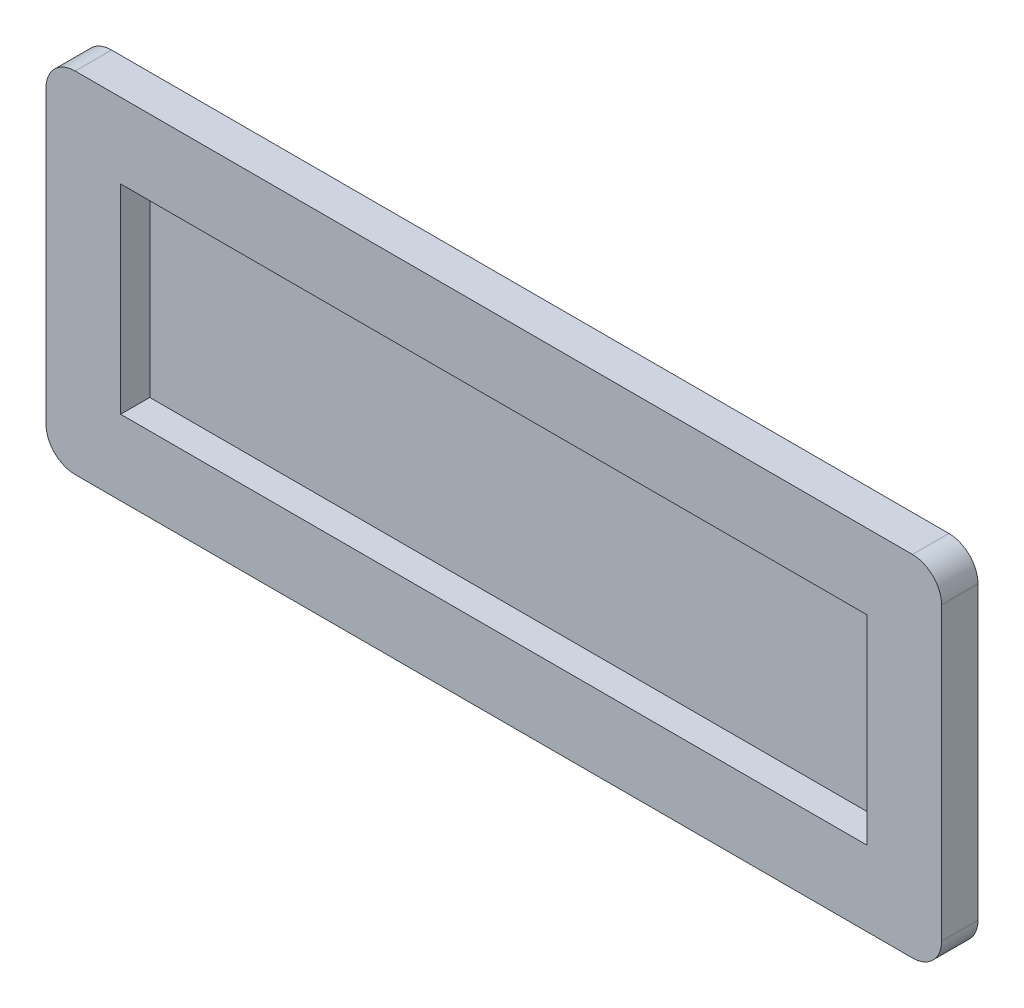
ISO-10303-21;
HEADER;
FILE_DESCRIPTION(('STEP AP214'),'2;1');
FILE_NAME('part.step','',(''),(''),'','','');
FILE_SCHEMA(('AUTOMOTIVE_DESIGN { 1 0 10303 214 1 1 1 1 }'));
ENDSEC;
DATA;
#1=APPLICATION_CONTEXT('core data for automotive mechanical design processes');
#2=APPLICATION_PROTOCOL_DEFINITION('international standard','automotive_design',2000,#1);
#3=PRODUCT_CONTEXT('',#1,'mechanical');
#4=PRODUCT('Part','Part','',(#3));
#5=PRODUCT_RELATED_PRODUCT_CATEGORY('part','',(#4));
#6=PRODUCT_DEFINITION_FORMATION('','',#4);
#7=PRODUCT_DEFINITION_CONTEXT('part definition',#1,'design');
#8=PRODUCT_DEFINITION('design','',#6,#7);
#9=PRODUCT_DEFINITION_SHAPE('','',#8);
#10=(LENGTH_UNIT() NAMED_UNIT(*) SI_UNIT(.MILLI.,.METRE.));
#11=(NAMED_UNIT(*) PLANE_ANGLE_UNIT() SI_UNIT($,.RADIAN.));
#12=(NAMED_UNIT(*) SI_UNIT($,.STERADIAN.) SOLID_ANGLE_UNIT());
#13=UNCERTAINTY_MEASURE_WITH_UNIT(LENGTH_MEASURE(1.E-05),#10,'distance_accuracy_value','');
#14=(GEOMETRIC_REPRESENTATION_CONTEXT(3) GLOBAL_UNCERTAINTY_ASSIGNED_CONTEXT((#13)) GLOBAL_UNIT_ASSIGNED_CONTEXT((#10,
#11,#12)) REPRESENTATION_CONTEXT('',''));
#15=CARTESIAN_POINT('',(0.,0.,0.));
#16=DIRECTION('',(0.,0.,1.));
#17=DIRECTION('',(1.,0.,0.));
#18=AXIS2_PLACEMENT_3D('',#15,#16,#17);
#19=CARTESIAN_POINT('',(20.5,75.4,10.));
#20=DIRECTION('',(1.,0.,0.));
#21=DIRECTION('',(0.,1.,0.));
#22=AXIS2_PLACEMENT_3D('',#19,#20,#21);
#23=PLANE('',#22);
#24=DIRECTION('',(0.,0.,-1.));
#25=VECTOR('',#24,1.);
#26=CARTESIAN_POINT('',(20.5,20.6,10.));
#27=LINE('',#26,#25);
#28=CARTESIAN_POINT('',(20.5,20.6,10.));
#29=VERTEX_POINT('',#28);
#30=CARTESIAN_POINT('',(20.5,20.6,2.));
#31=VERTEX_POINT('',#30);
#32=EDGE_CURVE('E136',#29,#31,#27,.T.);
#33=ORIENTED_EDGE('',*,*,#32,.T.);
#34=DIRECTION('',(0.,1.,0.));
#35=VECTOR('',#34,1.);
#36=CARTESIAN_POINT('',(20.5,20.6,2.));
#37=LINE('',#36,#35);
#38=CARTESIAN_POINT('',(20.5,75.4,2.));
#39=VERTEX_POINT('',#38);
#40=EDGE_CURVE('E124',#31,#39,#37,.T.);
#41=ORIENTED_EDGE('',*,*,#40,.T.);
#42=DIRECTION('',(0.,0.,-1.));
#43=VECTOR('',#42,1.);
#44=CARTESIAN_POINT('',(20.5,75.4,10.));
#45=LINE('',#44,#43);
#46=CARTESIAN_POINT('',(20.5,75.4,10.));
#47=VERTEX_POINT('',#46);
#48=EDGE_CURVE('E133',#47,#39,#45,.T.);
#49=ORIENTED_EDGE('',*,*,#48,.F.);
#50=DIRECTION('',(0.,-1.,0.));
#51=VECTOR('',#50,1.);
#52=CARTESIAN_POINT('',(20.5,75.4,10.));
#53=LINE('',#52,#51);
#54=EDGE_CURVE('E370',#47,#29,#53,.T.);
#55=ORIENTED_EDGE('',*,*,#54,.T.);
#56=EDGE_LOOP('',(#33,#41,#49,#55));
#57=FACE_BOUND('',#56,.T.);
#58=ADVANCED_FACE('F33',(#57),#23,.T.);
#59=CARTESIAN_POINT('',(20.5,20.6,10.));
#60=DIRECTION('',(0.,1.,0.));
#61=DIRECTION('',(0.,0.,1.));
#62=AXIS2_PLACEMENT_3D('',#59,#60,#61);
#63=PLANE('',#62);
#64=DIRECTION('',(0.,0.,-1.));
#65=VECTOR('',#64,1.);
#66=CARTESIAN_POINT('',(225.5,20.6,10.));
#67=LINE('',#66,#65);
#68=CARTESIAN_POINT('',(225.5,20.6,10.));
#69=VERTEX_POINT('',#68);
#70=CARTESIAN_POINT('',(225.5,20.6,2.));
#71=VERTEX_POINT('',#70);
#72=EDGE_CURVE('E143',#69,#71,#67,.T.);
#73=ORIENTED_EDGE('',*,*,#72,.T.);
#74=DIRECTION('',(-1.,0.,0.));
#75=VECTOR('',#74,1.);
#76=CARTESIAN_POINT('',(20.5,20.6,2.));
#77=LINE('',#76,#75);
#78=EDGE_CURVE('E371',#71,#31,#77,.T.);
#79=ORIENTED_EDGE('',*,*,#78,.T.);
#80=ORIENTED_EDGE('',*,*,#32,.F.);
#81=DIRECTION('',(1.,0.,0.));
#82=VECTOR('',#81,1.);
#83=CARTESIAN_POINT('',(20.5,20.6,10.));
#84=LINE('',#83,#82);
#85=EDGE_CURVE('E369',#29,#69,#84,.T.);
#86=ORIENTED_EDGE('',*,*,#85,.T.);
#87=EDGE_LOOP('',(#73,#79,#80,#86));
#88=FACE_BOUND('',#87,.T.);
#89=ADVANCED_FACE('F247',(#88),#63,.T.);
#90=CARTESIAN_POINT('',(225.5,75.4,10.));
#91=DIRECTION('',(-1.,0.,0.));
#92=DIRECTION('',(0.,0.,1.));
#93=AXIS2_PLACEMENT_3D('',#90,#91,#92);
#94=PLANE('',#93);
#95=DIRECTION('',(0.,0.,-1.));
#96=VECTOR('',#95,1.);
#97=CARTESIAN_POINT('',(225.5,75.4,10.));
#98=LINE('',#97,#96);
#99=CARTESIAN_POINT('',(225.5,75.4,10.));
#100=VERTEX_POINT('',#99);
#101=CARTESIAN_POINT('',(225.5,75.4,2.));
#102=VERTEX_POINT('',#101);
#103=EDGE_CURVE('E141',#100,#102,#98,.T.);
#104=ORIENTED_EDGE('',*,*,#103,.T.);
#105=DIRECTION('',(0.,-1.,0.));
#106=VECTOR('',#105,1.);
#107=CARTESIAN_POINT('',(225.5,20.6,2.));
#108=LINE('',#107,#106);
#109=EDGE_CURVE('E48',#102,#71,#108,.T.);
#110=ORIENTED_EDGE('',*,*,#109,.T.);
#111=ORIENTED_EDGE('',*,*,#72,.F.);
#112=DIRECTION('',(0.,1.,0.));
#113=VECTOR('',#112,1.);
#114=CARTESIAN_POINT('',(225.5,75.4,10.));
#115=LINE('',#114,#113);
#116=EDGE_CURVE('E145',#69,#100,#115,.T.);
#117=ORIENTED_EDGE('',*,*,#116,.T.);
#118=EDGE_LOOP('',(#104,#110,#111,#117));
#119=FACE_BOUND('',#118,.T.);
#120=ADVANCED_FACE('F252',(#119),#94,.T.);
#121=CARTESIAN_POINT('',(20.5,75.4,10.));
#122=DIRECTION('',(0.,-1.,0.));
#123=DIRECTION('',(0.,0.,-1.));
#124=AXIS2_PLACEMENT_3D('',#121,#122,#123);
#125=PLANE('',#124);
#126=ORIENTED_EDGE('',*,*,#48,.T.);
#127=DIRECTION('',(1.,0.,0.));
#128=VECTOR('',#127,1.);
#129=CARTESIAN_POINT('',(20.5,75.4,2.));
#130=LINE('',#129,#128);
#131=EDGE_CURVE('E121',#39,#102,#130,.T.);
#132=ORIENTED_EDGE('',*,*,#131,.T.);
#133=ORIENTED_EDGE('',*,*,#103,.F.);
#134=DIRECTION('',(-1.,0.,0.));
#135=VECTOR('',#134,1.);
#136=CARTESIAN_POINT('',(20.5,75.4,10.));
#137=LINE('',#136,#135);
#138=EDGE_CURVE('E140',#100,#47,#137,.T.);
#139=ORIENTED_EDGE('',*,*,#138,.T.);
#140=EDGE_LOOP('',(#126,#132,#133,#139));
#141=FACE_BOUND('',#140,.T.);
#142=ADVANCED_FACE('F138',(#141),#125,.T.);
#143=CARTESIAN_POINT('',(0.,0.,10.));
#144=DIRECTION('',(0.,0.,-1.));
#145=DIRECTION('',(-1.,0.,0.));
#146=AXIS2_PLACEMENT_3D('',#143,#144,#145);
#147=PLANE('',#146);
#148=DIRECTION('',(0.,1.,0.));
#149=VECTOR('',#148,1.);
#150=CARTESIAN_POINT('',(246.,0.,10.));
#151=LINE('',#150,#149);
#152=CARTESIAN_POINT('',(246.,8.,10.));
#153=VERTEX_POINT('',#152);
#154=CARTESIAN_POINT('',(246.,88.,10.));
#155=VERTEX_POINT('',#154);
#156=EDGE_CURVE('E159',#153,#155,#151,.T.);
#157=ORIENTED_EDGE('',*,*,#156,.T.);
#158=CARTESIAN_POINT('',(238.,88.,10.));
#159=DIRECTION('',(0.,0.,-1.));
#160=DIRECTION('',(-1.,0.,0.));
#161=AXIS2_PLACEMENT_3D('',#158,#159,#160);
#162=CIRCLE('',#161,8.);
#163=CARTESIAN_POINT('',(238.,96.,10.));
#164=VERTEX_POINT('',#163);
#165=EDGE_CURVE('E198',#155,#164,#162,.F.);
#166=ORIENTED_EDGE('',*,*,#165,.T.);
#167=DIRECTION('',(-1.,0.,0.));
#168=VECTOR('',#167,1.);
#169=CARTESIAN_POINT('',(0.,96.,10.));
#170=LINE('',#169,#168);
#171=CARTESIAN_POINT('',(8.,96.,10.));
#172=VERTEX_POINT('',#171);
#173=EDGE_CURVE('E162',#164,#172,#170,.T.);
#174=ORIENTED_EDGE('',*,*,#173,.T.);
#175=CARTESIAN_POINT('',(8.,88.,10.));
#176=DIRECTION('',(0.,0.,-1.));
#177=DIRECTION('',(-1.,0.,0.));
#178=AXIS2_PLACEMENT_3D('',#175,#176,#177);
#179=CIRCLE('',#178,8.);
#180=CARTESIAN_POINT('',(0.,88.,10.));
#181=VERTEX_POINT('',#180);
#182=EDGE_CURVE('E194',#172,#181,#179,.F.);
#183=ORIENTED_EDGE('',*,*,#182,.T.);
#184=DIRECTION('',(0.,-1.,0.));
#185=VECTOR('',#184,1.);
#186=CARTESIAN_POINT('',(0.,0.,10.));
#187=LINE('',#186,#185);
#188=CARTESIAN_POINT('',(0.,8.,10.));
#189=VERTEX_POINT('',#188);
#190=EDGE_CURVE('E153',#181,#189,#187,.T.);
#191=ORIENTED_EDGE('',*,*,#190,.T.);
#192=CARTESIAN_POINT('',(8.,8.,10.));
#193=DIRECTION('',(0.,0.,-1.));
#194=DIRECTION('',(-1.,0.,0.));
#195=AXIS2_PLACEMENT_3D('',#192,#193,#194);
#196=CIRCLE('',#195,8.);
#197=CARTESIAN_POINT('',(8.,0.,10.));
#198=VERTEX_POINT('',#197);
#199=EDGE_CURVE('E192',#189,#198,#196,.F.);
#200=ORIENTED_EDGE('',*,*,#199,.T.);
#201=DIRECTION('',(1.,0.,0.));
#202=VECTOR('',#201,1.);
#203=CARTESIAN_POINT('',(0.,0.,10.));
#204=LINE('',#203,#202);
#205=CARTESIAN_POINT('',(238.,0.,10.));
#206=VERTEX_POINT('',#205);
#207=EDGE_CURVE('E156',#198,#206,#204,.T.);
#208=ORIENTED_EDGE('',*,*,#207,.T.);
#209=CARTESIAN_POINT('',(238.,8.,10.));
#210=DIRECTION('',(0.,0.,-1.));
#211=DIRECTION('',(-1.,0.,0.));
#212=AXIS2_PLACEMENT_3D('',#209,#210,#211);
#213=CIRCLE('',#212,8.);
#214=EDGE_CURVE('E196',#206,#153,#213,.F.);
#215=ORIENTED_EDGE('',*,*,#214,.T.);
#216=EDGE_LOOP('',(#157,#166,#174,#183,#191,#200,#208,#215));
#217=FACE_BOUND('',#216,.T.);
#218=ORIENTED_EDGE('',*,*,#54,.F.);
#219=ORIENTED_EDGE('',*,*,#138,.F.);
#220=ORIENTED_EDGE('',*,*,#116,.F.);
#221=ORIENTED_EDGE('',*,*,#85,.F.);
#222=EDGE_LOOP('',(#218,#219,#220,#221));
#223=FACE_BOUND('',#222,.T.);
#224=ADVANCED_FACE('F212',(#217,#223),#147,.F.);
#225=CARTESIAN_POINT('',(0.,0.,0.));
#226=DIRECTION('',(0.,0.,-1.));
#227=DIRECTION('',(-1.,0.,0.));
#228=AXIS2_PLACEMENT_3D('',#225,#226,#227);
#229=PLANE('',#228);
#230=DIRECTION('',(-1.,0.,0.));
#231=VECTOR('',#230,1.);
#232=CARTESIAN_POINT('',(0.,96.,0.));
#233=LINE('',#232,#231);
#234=CARTESIAN_POINT('',(238.,96.,0.));
#235=VERTEX_POINT('',#234);
#236=CARTESIAN_POINT('',(8.,96.,0.));
#237=VERTEX_POINT('',#236);
#238=EDGE_CURVE('E157',#235,#237,#233,.T.);
#239=ORIENTED_EDGE('',*,*,#238,.F.);
#240=CARTESIAN_POINT('',(238.,88.,0.));
#241=DIRECTION('',(0.,0.,-1.));
#242=DIRECTION('',(-1.,0.,0.));
#243=AXIS2_PLACEMENT_3D('',#240,#241,#242);
#244=CIRCLE('',#243,8.);
#245=CARTESIAN_POINT('',(246.,88.,0.));
#246=VERTEX_POINT('',#245);
#247=EDGE_CURVE('E185',#235,#246,#244,.T.);
#248=ORIENTED_EDGE('',*,*,#247,.T.);
#249=DIRECTION('',(0.,1.,0.));
#250=VECTOR('',#249,1.);
#251=CARTESIAN_POINT('',(246.,0.,0.));
#252=LINE('',#251,#250);
#253=CARTESIAN_POINT('',(246.,8.,0.));
#254=VERTEX_POINT('',#253);
#255=EDGE_CURVE('E170',#254,#246,#252,.T.);
#256=ORIENTED_EDGE('',*,*,#255,.F.);
#257=CARTESIAN_POINT('',(238.,8.,0.));
#258=DIRECTION('',(0.,0.,-1.));
#259=DIRECTION('',(-1.,0.,0.));
#260=AXIS2_PLACEMENT_3D('',#257,#258,#259);
#261=CIRCLE('',#260,8.);
#262=CARTESIAN_POINT('',(238.,0.,0.));
#263=VERTEX_POINT('',#262);
#264=EDGE_CURVE('E183',#254,#263,#261,.T.);
#265=ORIENTED_EDGE('',*,*,#264,.T.);
#266=DIRECTION('',(1.,0.,0.));
#267=VECTOR('',#266,1.);
#268=CARTESIAN_POINT('',(0.,0.,0.));
#269=LINE('',#268,#267);
#270=CARTESIAN_POINT('',(8.,0.,0.));
#271=VERTEX_POINT('',#270);
#272=EDGE_CURVE('E168',#271,#263,#269,.T.);
#273=ORIENTED_EDGE('',*,*,#272,.F.);
#274=CARTESIAN_POINT('',(8.,8.,0.));
#275=DIRECTION('',(0.,0.,-1.));
#276=DIRECTION('',(-1.,0.,0.));
#277=AXIS2_PLACEMENT_3D('',#274,#275,#276);
#278=CIRCLE('',#277,8.);
#279=CARTESIAN_POINT('',(0.,8.,0.));
#280=VERTEX_POINT('',#279);
#281=EDGE_CURVE('E179',#271,#280,#278,.T.);
#282=ORIENTED_EDGE('',*,*,#281,.T.);
#283=DIRECTION('',(0.,-1.,0.));
#284=VECTOR('',#283,1.);
#285=CARTESIAN_POINT('',(0.,0.,0.));
#286=LINE('',#285,#284);
#287=CARTESIAN_POINT('',(0.,88.,0.));
#288=VERTEX_POINT('',#287);
#289=EDGE_CURVE('E152',#288,#280,#286,.T.);
#290=ORIENTED_EDGE('',*,*,#289,.F.);
#291=CARTESIAN_POINT('',(8.,88.,0.));
#292=DIRECTION('',(0.,0.,-1.));
#293=DIRECTION('',(-1.,0.,0.));
#294=AXIS2_PLACEMENT_3D('',#291,#292,#293);
#295=CIRCLE('',#294,8.);
#296=EDGE_CURVE('E181',#288,#237,#295,.T.);
#297=ORIENTED_EDGE('',*,*,#296,.T.);
#298=EDGE_LOOP('',(#239,#248,#256,#265,#273,#282,#290,#297));
#299=FACE_BOUND('',#298,.T.);
#300=ADVANCED_FACE('F220',(#299),#229,.T.);
#301=CARTESIAN_POINT('',(0.,0.,10.));
#302=DIRECTION('',(1.,0.,0.));
#303=DIRECTION('',(0.,0.,-1.));
#304=AXIS2_PLACEMENT_3D('',#301,#302,#303);
#305=PLANE('',#304);
#306=ORIENTED_EDGE('',*,*,#190,.F.);
#307=DIRECTION('',(0.,0.,-1.));
#308=VECTOR('',#307,1.);
#309=CARTESIAN_POINT('',(0.,88.,10.));
#310=LINE('',#309,#308);
#311=EDGE_CURVE('E11',#181,#288,#310,.T.);
#312=ORIENTED_EDGE('',*,*,#311,.T.);
#313=ORIENTED_EDGE('',*,*,#289,.T.);
#314=DIRECTION('',(0.,0.,-1.));
#315=VECTOR('',#314,1.);
#316=CARTESIAN_POINT('',(0.,8.,10.));
#317=LINE('',#316,#315);
#318=EDGE_CURVE('E41',#280,#189,#317,.F.);
#319=ORIENTED_EDGE('',*,*,#318,.T.);
#320=EDGE_LOOP('',(#306,#312,#313,#319));
#321=FACE_BOUND('',#320,.T.);
#322=ADVANCED_FACE('F206',(#321),#305,.F.);
#323=CARTESIAN_POINT('',(0.,0.,10.));
#324=DIRECTION('',(0.,1.,0.));
#325=DIRECTION('',(0.,0.,1.));
#326=AXIS2_PLACEMENT_3D('',#323,#324,#325);
#327=PLANE('',#326);
#328=ORIENTED_EDGE('',*,*,#272,.T.);
#329=DIRECTION('',(0.,0.,-1.));
#330=VECTOR('',#329,1.);
#331=CARTESIAN_POINT('',(238.,0.,10.));
#332=LINE('',#331,#330);
#333=EDGE_CURVE('E56',#263,#206,#332,.F.);
#334=ORIENTED_EDGE('',*,*,#333,.T.);
#335=ORIENTED_EDGE('',*,*,#207,.F.);
#336=DIRECTION('',(0.,0.,-1.));
#337=VECTOR('',#336,1.);
#338=CARTESIAN_POINT('',(8.,0.,10.));
#339=LINE('',#338,#337);
#340=EDGE_CURVE('E200',#198,#271,#339,.T.);
#341=ORIENTED_EDGE('',*,*,#340,.T.);
#342=EDGE_LOOP('',(#328,#334,#335,#341));
#343=FACE_BOUND('',#342,.T.);
#344=ADVANCED_FACE('F217',(#343),#327,.F.);
#345=CARTESIAN_POINT('',(246.,0.,10.));
#346=DIRECTION('',(-1.,0.,0.));
#347=DIRECTION('',(0.,0.,1.));
#348=AXIS2_PLACEMENT_3D('',#345,#346,#347);
#349=PLANE('',#348);
#350=ORIENTED_EDGE('',*,*,#255,.T.);
#351=DIRECTION('',(0.,0.,-1.));
#352=VECTOR('',#351,1.);
#353=CARTESIAN_POINT('',(246.,88.,10.));
#354=LINE('',#353,#352);
#355=EDGE_CURVE('E190',#246,#155,#354,.F.);
#356=ORIENTED_EDGE('',*,*,#355,.T.);
#357=ORIENTED_EDGE('',*,*,#156,.F.);
#358=DIRECTION('',(0.,0.,-1.));
#359=VECTOR('',#358,1.);
#360=CARTESIAN_POINT('',(246.,8.,10.));
#361=LINE('',#360,#359);
#362=EDGE_CURVE('E187',#153,#254,#361,.T.);
#363=ORIENTED_EDGE('',*,*,#362,.T.);
#364=EDGE_LOOP('',(#350,#356,#357,#363));
#365=FACE_BOUND('',#364,.T.);
#366=ADVANCED_FACE('F228',(#365),#349,.F.);
#367=CARTESIAN_POINT('',(0.,96.,10.));
#368=DIRECTION('',(0.,-1.,0.));
#369=DIRECTION('',(0.,0.,-1.));
#370=AXIS2_PLACEMENT_3D('',#367,#368,#369);
#371=PLANE('',#370);
#372=ORIENTED_EDGE('',*,*,#173,.F.);
#373=DIRECTION('',(0.,0.,-1.));
#374=VECTOR('',#373,1.);
#375=CARTESIAN_POINT('',(238.,96.,10.));
#376=LINE('',#375,#374);
#377=EDGE_CURVE('E176',#164,#235,#376,.T.);
#378=ORIENTED_EDGE('',*,*,#377,.T.);
#379=ORIENTED_EDGE('',*,*,#238,.T.);
#380=DIRECTION('',(0.,0.,-1.));
#381=VECTOR('',#380,1.);
#382=CARTESIAN_POINT('',(8.,96.,10.));
#383=LINE('',#382,#381);
#384=EDGE_CURVE('E165',#237,#172,#383,.F.);
#385=ORIENTED_EDGE('',*,*,#384,.T.);
#386=EDGE_LOOP('',(#372,#378,#379,#385));
#387=FACE_BOUND('',#386,.T.);
#388=ADVANCED_FACE('F236',(#387),#371,.F.);
#389=CARTESIAN_POINT('',(238.,88.,10.));
#390=DIRECTION('',(0.,0.,-1.));
#391=DIRECTION('',(-1.,0.,0.));
#392=AXIS2_PLACEMENT_3D('',#389,#390,#391);
#393=CYLINDRICAL_SURFACE('',#392,8.);
#394=ORIENTED_EDGE('',*,*,#165,.F.);
#395=ORIENTED_EDGE('',*,*,#355,.F.);
#396=ORIENTED_EDGE('',*,*,#247,.F.);
#397=ORIENTED_EDGE('',*,*,#377,.F.);
#398=EDGE_LOOP('',(#394,#395,#396,#397));
#399=FACE_BOUND('',#398,.T.);
#400=ADVANCED_FACE('F234',(#399),#393,.T.);
#401=CARTESIAN_POINT('',(238.,8.,10.));
#402=DIRECTION('',(0.,0.,-1.));
#403=DIRECTION('',(-1.,0.,0.));
#404=AXIS2_PLACEMENT_3D('',#401,#402,#403);
#405=CYLINDRICAL_SURFACE('',#404,8.);
#406=ORIENTED_EDGE('',*,*,#214,.F.);
#407=ORIENTED_EDGE('',*,*,#333,.F.);
#408=ORIENTED_EDGE('',*,*,#264,.F.);
#409=ORIENTED_EDGE('',*,*,#362,.F.);
#410=EDGE_LOOP('',(#406,#407,#408,#409));
#411=FACE_BOUND('',#410,.T.);
#412=ADVANCED_FACE('F225',(#411),#405,.T.);
#413=CARTESIAN_POINT('',(8.,88.,10.));
#414=DIRECTION('',(0.,0.,-1.));
#415=DIRECTION('',(-1.,0.,0.));
#416=AXIS2_PLACEMENT_3D('',#413,#414,#415);
#417=CYLINDRICAL_SURFACE('',#416,8.);
#418=ORIENTED_EDGE('',*,*,#182,.F.);
#419=ORIENTED_EDGE('',*,*,#384,.F.);
#420=ORIENTED_EDGE('',*,*,#296,.F.);
#421=ORIENTED_EDGE('',*,*,#311,.F.);
#422=EDGE_LOOP('',(#418,#419,#420,#421));
#423=FACE_BOUND('',#422,.T.);
#424=ADVANCED_FACE('F239',(#423),#417,.T.);
#425=CARTESIAN_POINT('',(8.,8.,10.));
#426=DIRECTION('',(0.,0.,-1.));
#427=DIRECTION('',(-1.,0.,0.));
#428=AXIS2_PLACEMENT_3D('',#425,#426,#427);
#429=CYLINDRICAL_SURFACE('',#428,8.);
#430=ORIENTED_EDGE('',*,*,#199,.F.);
#431=ORIENTED_EDGE('',*,*,#318,.F.);
#432=ORIENTED_EDGE('',*,*,#281,.F.);
#433=ORIENTED_EDGE('',*,*,#340,.F.);
#434=EDGE_LOOP('',(#430,#431,#432,#433));
#435=FACE_BOUND('',#434,.T.);
#436=ADVANCED_FACE('F35',(#435),#429,.T.);
#437=CARTESIAN_POINT('',(0.,0.,2.));
#438=DIRECTION('',(0.,0.,-1.));
#439=DIRECTION('',(-1.,0.,0.));
#440=AXIS2_PLACEMENT_3D('',#437,#438,#439);
#441=PLANE('',#440);
#442=ORIENTED_EDGE('',*,*,#40,.F.);
#443=ORIENTED_EDGE('',*,*,#78,.F.);
#444=ORIENTED_EDGE('',*,*,#109,.F.);
#445=ORIENTED_EDGE('',*,*,#131,.F.);
#446=EDGE_LOOP('',(#442,#443,#444,#445));
#447=FACE_BOUND('',#446,.T.);
#448=ADVANCED_FACE('F123',(#447),#441,.F.);
#449=CLOSED_SHELL('',(#58,#89,#120,#142,#224,#300,#322,#344,#366,#388,#400,#412,#424,#436,#448));
#450=MANIFOLD_SOLID_BREP('B2',#449);
#451=ADVANCED_BREP_SHAPE_REPRESENTATION('',(#18,#450),#14);
#452=SHAPE_DEFINITION_REPRESENTATION(#9,#451);
ENDSEC;
END-ISO-10303-21;
